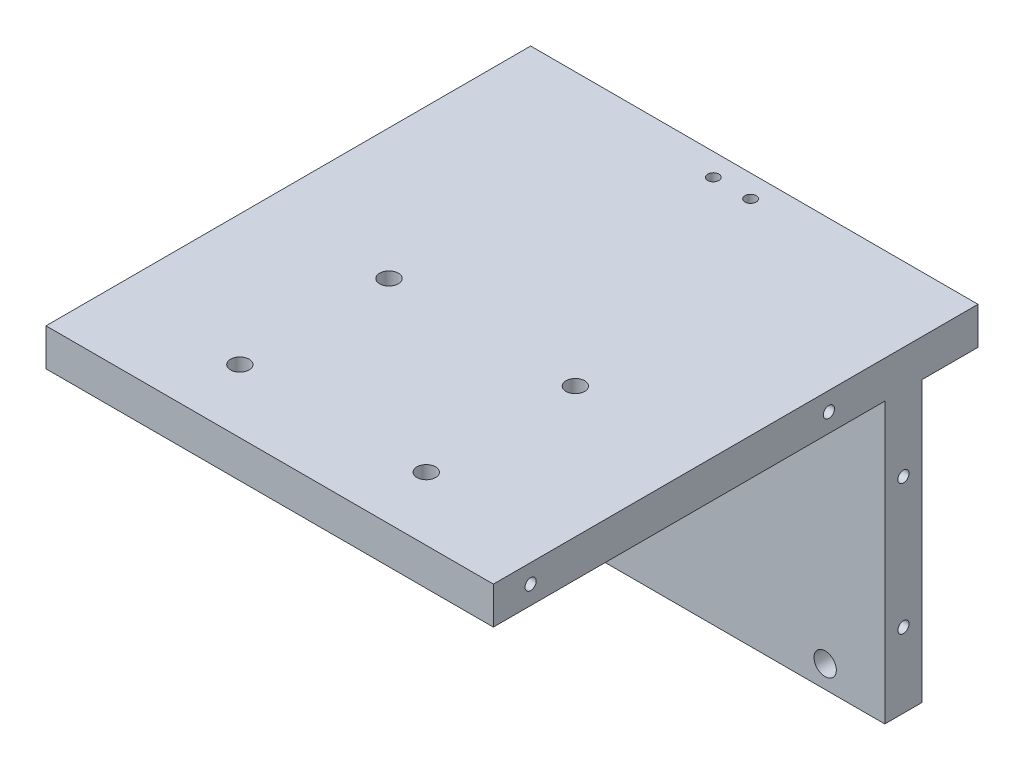
ISO-10303-21;
HEADER;
FILE_DESCRIPTION(('STEP AP214'),'2;1');
FILE_NAME('part.step','',(''),(''),'','','');
FILE_SCHEMA(('AUTOMOTIVE_DESIGN { 1 0 10303 214 1 1 1 1 }'));
ENDSEC;
DATA;
#1=APPLICATION_CONTEXT('core data for automotive mechanical design processes');
#2=APPLICATION_PROTOCOL_DEFINITION('international standard','automotive_design',2000,#1);
#3=PRODUCT_CONTEXT('',#1,'mechanical');
#4=PRODUCT('Part','Part','',(#3));
#5=PRODUCT_RELATED_PRODUCT_CATEGORY('part','',(#4));
#6=PRODUCT_DEFINITION_FORMATION('','',#4);
#7=PRODUCT_DEFINITION_CONTEXT('part definition',#1,'design');
#8=PRODUCT_DEFINITION('design','',#6,#7);
#9=PRODUCT_DEFINITION_SHAPE('','',#8);
#10=(LENGTH_UNIT() NAMED_UNIT(*) SI_UNIT(.MILLI.,.METRE.));
#11=(NAMED_UNIT(*) PLANE_ANGLE_UNIT() SI_UNIT($,.RADIAN.));
#12=(NAMED_UNIT(*) SI_UNIT($,.STERADIAN.) SOLID_ANGLE_UNIT());
#13=UNCERTAINTY_MEASURE_WITH_UNIT(LENGTH_MEASURE(1.E-05),#10,'distance_accuracy_value','');
#14=(GEOMETRIC_REPRESENTATION_CONTEXT(3) GLOBAL_UNCERTAINTY_ASSIGNED_CONTEXT((#13)) GLOBAL_UNIT_ASSIGNED_CONTEXT((#10,
#11,#12)) REPRESENTATION_CONTEXT('',''));
#15=CARTESIAN_POINT('',(0.,0.,0.));
#16=DIRECTION('',(0.,0.,1.));
#17=DIRECTION('',(1.,0.,0.));
#18=AXIS2_PLACEMENT_3D('',#15,#16,#17);
#19=CARTESIAN_POINT('',(0.,0.,10.));
#20=DIRECTION('',(0.,0.,1.));
#21=DIRECTION('',(1.,0.,0.));
#22=AXIS2_PLACEMENT_3D('',#19,#20,#21);
#23=PLANE('',#22);
#24=CARTESIAN_POINT('',(2.09489001666563E-13,-10.,10.));
#25=DIRECTION('',(0.,0.,1.));
#26=DIRECTION('',(1.,0.,0.));
#27=AXIS2_PLACEMENT_3D('',#24,#25,#26);
#28=CIRCLE('',#27,2.5);
#29=CARTESIAN_POINT('',(2.50000000000021,-10.,10.));
#30=VERTEX_POINT('',#29);
#31=EDGE_CURVE('E170',#30,#30,#28,.T.);
#32=ORIENTED_EDGE('',*,*,#31,.F.);
#33=EDGE_LOOP('',(#32));
#34=FACE_BOUND('',#33,.T.);
#35=CARTESIAN_POINT('',(0.,10.,10.));
#36=DIRECTION('',(0.,0.,1.));
#37=DIRECTION('',(1.,0.,0.));
#38=AXIS2_PLACEMENT_3D('',#35,#36,#37);
#39=CIRCLE('',#38,2.5);
#40=CARTESIAN_POINT('',(2.5,10.,10.));
#41=VERTEX_POINT('',#40);
#42=EDGE_CURVE('E164',#41,#41,#39,.T.);
#43=ORIENTED_EDGE('',*,*,#42,.F.);
#44=EDGE_LOOP('',(#43));
#45=FACE_BOUND('',#44,.T.);
#46=CARTESIAN_POINT('',(-43.9999999999993,-31.5,10.));
#47=DIRECTION('',(0.,0.,1.));
#48=DIRECTION('',(1.,0.,0.));
#49=AXIS2_PLACEMENT_3D('',#46,#47,#48);
#50=CIRCLE('',#49,3.);
#51=CARTESIAN_POINT('',(-40.9999999999993,-31.5,10.));
#52=VERTEX_POINT('',#51);
#53=EDGE_CURVE('E147',#52,#52,#50,.T.);
#54=ORIENTED_EDGE('',*,*,#53,.F.);
#55=EDGE_LOOP('',(#54));
#56=FACE_BOUND('',#55,.T.);
#57=CARTESIAN_POINT('',(-44.,31.5,10.));
#58=DIRECTION('',(0.,0.,1.));
#59=DIRECTION('',(1.,0.,0.));
#60=AXIS2_PLACEMENT_3D('',#57,#58,#59);
#61=CIRCLE('',#60,3.);
#62=CARTESIAN_POINT('',(-41.,31.5,10.));
#63=VERTEX_POINT('',#62);
#64=EDGE_CURVE('E133',#63,#63,#61,.T.);
#65=ORIENTED_EDGE('',*,*,#64,.F.);
#66=EDGE_LOOP('',(#65));
#67=FACE_BOUND('',#66,.T.);
#68=DIRECTION('',(0.,1.,0.));
#69=VECTOR('',#68,1.);
#70=CARTESIAN_POINT('',(60.,37.5,10.));
#71=LINE('',#70,#69);
#72=CARTESIAN_POINT('',(60.,-37.5,10.));
#73=VERTEX_POINT('',#72);
#74=CARTESIAN_POINT('',(60.,37.5,10.));
#75=VERTEX_POINT('',#74);
#76=EDGE_CURVE('E103',#73,#75,#71,.T.);
#77=ORIENTED_EDGE('',*,*,#76,.T.);
#78=DIRECTION('',(-1.,0.,0.));
#79=VECTOR('',#78,1.);
#80=CARTESIAN_POINT('',(-60.,37.5,10.));
#81=LINE('',#80,#79);
#82=CARTESIAN_POINT('',(-60.,37.5,10.));
#83=VERTEX_POINT('',#82);
#84=EDGE_CURVE('E89',#75,#83,#81,.T.);
#85=ORIENTED_EDGE('',*,*,#84,.T.);
#86=DIRECTION('',(0.,-1.,0.));
#87=VECTOR('',#86,1.);
#88=CARTESIAN_POINT('',(-60.,37.5,10.));
#89=LINE('',#88,#87);
#90=CARTESIAN_POINT('',(-60.,-37.5,10.));
#91=VERTEX_POINT('',#90);
#92=EDGE_CURVE('E101',#83,#91,#89,.T.);
#93=ORIENTED_EDGE('',*,*,#92,.T.);
#94=DIRECTION('',(1.,0.,0.));
#95=VECTOR('',#94,1.);
#96=CARTESIAN_POINT('',(-60.,-37.5,10.));
#97=LINE('',#96,#95);
#98=EDGE_CURVE('E54',#91,#73,#97,.T.);
#99=ORIENTED_EDGE('',*,*,#98,.T.);
#100=EDGE_LOOP('',(#77,#85,#93,#99));
#101=FACE_BOUND('',#100,.T.);
#102=CARTESIAN_POINT('',(44.,31.5,10.));
#103=DIRECTION('',(0.,0.,1.));
#104=DIRECTION('',(1.,0.,0.));
#105=AXIS2_PLACEMENT_3D('',#102,#103,#104);
#106=CIRCLE('',#105,3.);
#107=CARTESIAN_POINT('',(47.,31.5,10.));
#108=VERTEX_POINT('',#107);
#109=EDGE_CURVE('E140',#108,#108,#106,.T.);
#110=ORIENTED_EDGE('',*,*,#109,.F.);
#111=EDGE_LOOP('',(#110));
#112=FACE_BOUND('',#111,.T.);
#113=CARTESIAN_POINT('',(44.0000000000007,-31.5,10.));
#114=DIRECTION('',(0.,0.,1.));
#115=DIRECTION('',(1.,0.,0.));
#116=AXIS2_PLACEMENT_3D('',#113,#114,#115);
#117=CIRCLE('',#116,3.);
#118=CARTESIAN_POINT('',(47.0000000000007,-31.5,10.));
#119=VERTEX_POINT('',#118);
#120=EDGE_CURVE('E153',#119,#119,#117,.T.);
#121=ORIENTED_EDGE('',*,*,#120,.F.);
#122=EDGE_LOOP('',(#121));
#123=FACE_BOUND('',#122,.T.);
#124=ADVANCED_FACE('F35',(#34,#45,#56,#67,#101,#112,#123),#23,.T.);
#125=CARTESIAN_POINT('',(0.,0.,0.));
#126=DIRECTION('',(0.,0.,1.));
#127=DIRECTION('',(1.,0.,0.));
#128=AXIS2_PLACEMENT_3D('',#125,#126,#127);
#129=PLANE('',#128);
#130=CARTESIAN_POINT('',(2.09489001666563E-13,-10.,0.));
#131=DIRECTION('',(0.,0.,1.));
#132=DIRECTION('',(1.,0.,0.));
#133=AXIS2_PLACEMENT_3D('',#130,#131,#132);
#134=CIRCLE('',#133,2.5);
#135=CARTESIAN_POINT('',(2.50000000000021,-10.,0.));
#136=VERTEX_POINT('',#135);
#137=EDGE_CURVE('E167',#136,#136,#134,.F.);
#138=ORIENTED_EDGE('',*,*,#137,.F.);
#139=EDGE_LOOP('',(#138));
#140=FACE_BOUND('',#139,.T.);
#141=CARTESIAN_POINT('',(0.,10.,0.));
#142=DIRECTION('',(0.,0.,1.));
#143=DIRECTION('',(1.,0.,0.));
#144=AXIS2_PLACEMENT_3D('',#141,#142,#143);
#145=CIRCLE('',#144,2.5);
#146=CARTESIAN_POINT('',(2.5,10.,0.));
#147=VERTEX_POINT('',#146);
#148=EDGE_CURVE('E159',#147,#147,#145,.F.);
#149=ORIENTED_EDGE('',*,*,#148,.F.);
#150=EDGE_LOOP('',(#149));
#151=FACE_BOUND('',#150,.T.);
#152=CARTESIAN_POINT('',(-43.9999999999993,-31.5,0.));
#153=DIRECTION('',(0.,0.,1.));
#154=DIRECTION('',(1.,0.,0.));
#155=AXIS2_PLACEMENT_3D('',#152,#153,#154);
#156=CIRCLE('',#155,3.);
#157=CARTESIAN_POINT('',(-40.9999999999993,-31.5,0.));
#158=VERTEX_POINT('',#157);
#159=EDGE_CURVE('E150',#158,#158,#156,.T.);
#160=ORIENTED_EDGE('',*,*,#159,.T.);
#161=EDGE_LOOP('',(#160));
#162=FACE_BOUND('',#161,.T.);
#163=CARTESIAN_POINT('',(-44.,31.5,0.));
#164=DIRECTION('',(0.,0.,1.));
#165=DIRECTION('',(1.,0.,0.));
#166=AXIS2_PLACEMENT_3D('',#163,#164,#165);
#167=CIRCLE('',#166,3.);
#168=CARTESIAN_POINT('',(-41.,31.5,0.));
#169=VERTEX_POINT('',#168);
#170=EDGE_CURVE('E135',#169,#169,#167,.T.);
#171=ORIENTED_EDGE('',*,*,#170,.T.);
#172=EDGE_LOOP('',(#171));
#173=FACE_BOUND('',#172,.T.);
#174=DIRECTION('',(0.,1.,0.));
#175=VECTOR('',#174,1.);
#176=CARTESIAN_POINT('',(60.,37.5,0.));
#177=LINE('',#176,#175);
#178=CARTESIAN_POINT('',(60.,-37.5,0.));
#179=VERTEX_POINT('',#178);
#180=CARTESIAN_POINT('',(60.,37.5,0.));
#181=VERTEX_POINT('',#180);
#182=EDGE_CURVE('E119',#179,#181,#177,.T.);
#183=ORIENTED_EDGE('',*,*,#182,.F.);
#184=DIRECTION('',(1.,0.,0.));
#185=VECTOR('',#184,1.);
#186=CARTESIAN_POINT('',(-60.,-37.5,0.));
#187=LINE('',#186,#185);
#188=CARTESIAN_POINT('',(-60.,-37.5,0.));
#189=VERTEX_POINT('',#188);
#190=EDGE_CURVE('E113',#189,#179,#187,.T.);
#191=ORIENTED_EDGE('',*,*,#190,.F.);
#192=DIRECTION('',(0.,-1.,0.));
#193=VECTOR('',#192,1.);
#194=CARTESIAN_POINT('',(-60.,37.5,0.));
#195=LINE('',#194,#193);
#196=CARTESIAN_POINT('',(-60.,37.5,0.));
#197=VERTEX_POINT('',#196);
#198=EDGE_CURVE('E66',#197,#189,#195,.T.);
#199=ORIENTED_EDGE('',*,*,#198,.F.);
#200=DIRECTION('',(-1.,0.,0.));
#201=VECTOR('',#200,1.);
#202=CARTESIAN_POINT('',(-60.,37.5,0.));
#203=LINE('',#202,#201);
#204=EDGE_CURVE('E116',#181,#197,#203,.T.);
#205=ORIENTED_EDGE('',*,*,#204,.F.);
#206=EDGE_LOOP('',(#183,#191,#199,#205));
#207=FACE_BOUND('',#206,.T.);
#208=CARTESIAN_POINT('',(44.,31.5,0.));
#209=DIRECTION('',(0.,0.,1.));
#210=DIRECTION('',(1.,0.,0.));
#211=AXIS2_PLACEMENT_3D('',#208,#209,#210);
#212=CIRCLE('',#211,3.);
#213=CARTESIAN_POINT('',(47.,31.5,0.));
#214=VERTEX_POINT('',#213);
#215=EDGE_CURVE('E143',#214,#214,#212,.T.);
#216=ORIENTED_EDGE('',*,*,#215,.T.);
#217=EDGE_LOOP('',(#216));
#218=FACE_BOUND('',#217,.T.);
#219=CARTESIAN_POINT('',(44.0000000000007,-31.5,0.));
#220=DIRECTION('',(0.,0.,1.));
#221=DIRECTION('',(1.,0.,0.));
#222=AXIS2_PLACEMENT_3D('',#219,#220,#221);
#223=CIRCLE('',#222,3.);
#224=CARTESIAN_POINT('',(47.0000000000007,-31.5,0.));
#225=VERTEX_POINT('',#224);
#226=EDGE_CURVE('E156',#225,#225,#223,.T.);
#227=ORIENTED_EDGE('',*,*,#226,.T.);
#228=EDGE_LOOP('',(#227));
#229=FACE_BOUND('',#228,.T.);
#230=ADVANCED_FACE('F131',(#140,#151,#162,#173,#207,#218,#229),#129,.F.);
#231=CARTESIAN_POINT('',(60.,37.5,10.));
#232=DIRECTION('',(-1.,0.,0.));
#233=DIRECTION('',(0.,-1.,0.));
#234=AXIS2_PLACEMENT_3D('',#231,#232,#233);
#235=PLANE('',#234);
#236=CARTESIAN_POINT('',(60.,42.5,25.));
#237=DIRECTION('',(1.,0.,0.));
#238=DIRECTION('',(0.,1.,0.));
#239=AXIS2_PLACEMENT_3D('',#236,#237,#238);
#240=CIRCLE('',#239,1.5);
#241=CARTESIAN_POINT('',(60.,44.,25.));
#242=VERTEX_POINT('',#241);
#243=EDGE_CURVE('E240',#242,#242,#240,.T.);
#244=ORIENTED_EDGE('',*,*,#243,.F.);
#245=EDGE_LOOP('',(#244));
#246=FACE_BOUND('',#245,.T.);
#247=CARTESIAN_POINT('',(60.,42.5,105.));
#248=DIRECTION('',(1.,0.,0.));
#249=DIRECTION('',(0.,1.,0.));
#250=AXIS2_PLACEMENT_3D('',#247,#248,#249);
#251=CIRCLE('',#250,1.5);
#252=CARTESIAN_POINT('',(60.,44.,105.));
#253=VERTEX_POINT('',#252);
#254=EDGE_CURVE('E234',#253,#253,#251,.T.);
#255=ORIENTED_EDGE('',*,*,#254,.F.);
#256=EDGE_LOOP('',(#255));
#257=FACE_BOUND('',#256,.T.);
#258=CARTESIAN_POINT('',(60.,-17.5,4.99999999999963));
#259=DIRECTION('',(1.,0.,0.));
#260=DIRECTION('',(0.,1.,0.));
#261=AXIS2_PLACEMENT_3D('',#258,#259,#260);
#262=CIRCLE('',#261,1.5);
#263=CARTESIAN_POINT('',(60.,-16.,4.99999999999963));
#264=VERTEX_POINT('',#263);
#265=EDGE_CURVE('E180',#264,#264,#262,.T.);
#266=ORIENTED_EDGE('',*,*,#265,.F.);
#267=EDGE_LOOP('',(#266));
#268=FACE_BOUND('',#267,.T.);
#269=CARTESIAN_POINT('',(60.,17.5,5.));
#270=DIRECTION('',(1.,0.,0.));
#271=DIRECTION('',(0.,1.,0.));
#272=AXIS2_PLACEMENT_3D('',#269,#270,#271);
#273=CIRCLE('',#272,1.5);
#274=CARTESIAN_POINT('',(60.,19.,5.));
#275=VERTEX_POINT('',#274);
#276=EDGE_CURVE('E174',#275,#275,#273,.T.);
#277=ORIENTED_EDGE('',*,*,#276,.F.);
#278=EDGE_LOOP('',(#277));
#279=FACE_BOUND('',#278,.T.);
#280=ORIENTED_EDGE('',*,*,#182,.T.);
#281=DIRECTION('',(0.,0.,-1.));
#282=VECTOR('',#281,1.);
#283=CARTESIAN_POINT('',(60.,37.5,-15.));
#284=LINE('',#283,#282);
#285=CARTESIAN_POINT('',(60.,37.5,-15.));
#286=VERTEX_POINT('',#285);
#287=EDGE_CURVE('E75',#181,#286,#284,.T.);
#288=ORIENTED_EDGE('',*,*,#287,.T.);
#289=DIRECTION('',(0.,-1.,0.));
#290=VECTOR('',#289,1.);
#291=CARTESIAN_POINT('',(60.,47.5,-15.));
#292=LINE('',#291,#290);
#293=CARTESIAN_POINT('',(60.,47.5,-15.));
#294=VERTEX_POINT('',#293);
#295=EDGE_CURVE('E213',#294,#286,#292,.T.);
#296=ORIENTED_EDGE('',*,*,#295,.F.);
#297=DIRECTION('',(0.,0.,-1.));
#298=VECTOR('',#297,1.);
#299=CARTESIAN_POINT('',(60.,47.5,-15.));
#300=LINE('',#299,#298);
#301=CARTESIAN_POINT('',(60.,47.5,115.));
#302=VERTEX_POINT('',#301);
#303=EDGE_CURVE('E226',#302,#294,#300,.T.);
#304=ORIENTED_EDGE('',*,*,#303,.F.);
#305=DIRECTION('',(0.,-1.,0.));
#306=VECTOR('',#305,1.);
#307=CARTESIAN_POINT('',(60.,47.5,115.));
#308=LINE('',#307,#306);
#309=CARTESIAN_POINT('',(60.,37.5,115.));
#310=VERTEX_POINT('',#309);
#311=EDGE_CURVE('E217',#302,#310,#308,.T.);
#312=ORIENTED_EDGE('',*,*,#311,.T.);
#313=EDGE_CURVE('E200',#310,#75,#284,.T.);
#314=ORIENTED_EDGE('',*,*,#313,.T.);
#315=ORIENTED_EDGE('',*,*,#76,.F.);
#316=DIRECTION('',(0.,0.,-1.));
#317=VECTOR('',#316,1.);
#318=CARTESIAN_POINT('',(60.,-37.5,10.));
#319=LINE('',#318,#317);
#320=EDGE_CURVE('E45',#73,#179,#319,.T.);
#321=ORIENTED_EDGE('',*,*,#320,.T.);
#322=EDGE_LOOP('',(#280,#288,#296,#304,#312,#314,#315,#321));
#323=FACE_BOUND('',#322,.T.);
#324=ADVANCED_FACE('F37',(#246,#257,#268,#279,#323),#235,.F.);
#325=CARTESIAN_POINT('',(-60.,37.5,10.));
#326=DIRECTION('',(1.,0.,0.));
#327=DIRECTION('',(0.,1.,0.));
#328=AXIS2_PLACEMENT_3D('',#325,#326,#327);
#329=PLANE('',#328);
#330=CARTESIAN_POINT('',(-60.,42.5,25.));
#331=DIRECTION('',(1.,0.,0.));
#332=DIRECTION('',(0.,1.,0.));
#333=AXIS2_PLACEMENT_3D('',#330,#331,#332);
#334=CIRCLE('',#333,1.5);
#335=CARTESIAN_POINT('',(-60.,44.,25.));
#336=VERTEX_POINT('',#335);
#337=EDGE_CURVE('E249',#336,#336,#334,.T.);
#338=ORIENTED_EDGE('',*,*,#337,.T.);
#339=EDGE_LOOP('',(#338));
#340=FACE_BOUND('',#339,.T.);
#341=CARTESIAN_POINT('',(-60.,42.5,105.));
#342=DIRECTION('',(1.,0.,0.));
#343=DIRECTION('',(0.,1.,0.));
#344=AXIS2_PLACEMENT_3D('',#341,#342,#343);
#345=CIRCLE('',#344,1.5);
#346=CARTESIAN_POINT('',(-60.,44.,105.));
#347=VERTEX_POINT('',#346);
#348=EDGE_CURVE('E243',#347,#347,#345,.T.);
#349=ORIENTED_EDGE('',*,*,#348,.T.);
#350=EDGE_LOOP('',(#349));
#351=FACE_BOUND('',#350,.T.);
#352=CARTESIAN_POINT('',(-60.,-17.5,4.99999999999963));
#353=DIRECTION('',(1.,0.,0.));
#354=DIRECTION('',(0.,1.,0.));
#355=AXIS2_PLACEMENT_3D('',#352,#353,#354);
#356=CIRCLE('',#355,1.5);
#357=CARTESIAN_POINT('',(-60.,-16.,4.99999999999963));
#358=VERTEX_POINT('',#357);
#359=EDGE_CURVE('E189',#358,#358,#356,.T.);
#360=ORIENTED_EDGE('',*,*,#359,.T.);
#361=EDGE_LOOP('',(#360));
#362=FACE_BOUND('',#361,.T.);
#363=CARTESIAN_POINT('',(-60.,17.5,5.));
#364=DIRECTION('',(1.,0.,0.));
#365=DIRECTION('',(0.,1.,0.));
#366=AXIS2_PLACEMENT_3D('',#363,#364,#365);
#367=CIRCLE('',#366,1.5);
#368=CARTESIAN_POINT('',(-60.,19.,5.));
#369=VERTEX_POINT('',#368);
#370=EDGE_CURVE('E183',#369,#369,#367,.T.);
#371=ORIENTED_EDGE('',*,*,#370,.T.);
#372=EDGE_LOOP('',(#371));
#373=FACE_BOUND('',#372,.T.);
#374=ORIENTED_EDGE('',*,*,#198,.T.);
#375=DIRECTION('',(0.,0.,-1.));
#376=VECTOR('',#375,1.);
#377=CARTESIAN_POINT('',(-60.,-37.5,10.));
#378=LINE('',#377,#376);
#379=EDGE_CURVE('E11',#91,#189,#378,.T.);
#380=ORIENTED_EDGE('',*,*,#379,.F.);
#381=ORIENTED_EDGE('',*,*,#92,.F.);
#382=DIRECTION('',(0.,0.,1.));
#383=VECTOR('',#382,1.);
#384=CARTESIAN_POINT('',(-60.,37.5,-15.));
#385=LINE('',#384,#383);
#386=CARTESIAN_POINT('',(-60.,37.5,115.));
#387=VERTEX_POINT('',#386);
#388=EDGE_CURVE('E85',#83,#387,#385,.T.);
#389=ORIENTED_EDGE('',*,*,#388,.T.);
#390=DIRECTION('',(0.,-1.,0.));
#391=VECTOR('',#390,1.);
#392=CARTESIAN_POINT('',(-60.,47.5,115.));
#393=LINE('',#392,#391);
#394=CARTESIAN_POINT('',(-60.,47.5,115.));
#395=VERTEX_POINT('',#394);
#396=EDGE_CURVE('E195',#395,#387,#393,.T.);
#397=ORIENTED_EDGE('',*,*,#396,.F.);
#398=DIRECTION('',(0.,0.,1.));
#399=VECTOR('',#398,1.);
#400=CARTESIAN_POINT('',(-60.,47.5,-15.));
#401=LINE('',#400,#399);
#402=CARTESIAN_POINT('',(-60.,47.5,-15.));
#403=VERTEX_POINT('',#402);
#404=EDGE_CURVE('E209',#403,#395,#401,.T.);
#405=ORIENTED_EDGE('',*,*,#404,.F.);
#406=DIRECTION('',(0.,-1.,0.));
#407=VECTOR('',#406,1.);
#408=CARTESIAN_POINT('',(-60.,47.5,-15.));
#409=LINE('',#408,#407);
#410=CARTESIAN_POINT('',(-60.,37.5,-15.));
#411=VERTEX_POINT('',#410);
#412=EDGE_CURVE('E210',#403,#411,#409,.T.);
#413=ORIENTED_EDGE('',*,*,#412,.T.);
#414=EDGE_CURVE('E97',#411,#197,#385,.T.);
#415=ORIENTED_EDGE('',*,*,#414,.T.);
#416=EDGE_LOOP('',(#374,#380,#381,#389,#397,#405,#413,#415));
#417=FACE_BOUND('',#416,.T.);
#418=ADVANCED_FACE('F105',(#340,#351,#362,#373,#417),#329,.F.);
#419=CARTESIAN_POINT('',(-60.,-37.5,10.));
#420=DIRECTION('',(0.,1.,0.));
#421=DIRECTION('',(0.,0.,1.));
#422=AXIS2_PLACEMENT_3D('',#419,#420,#421);
#423=PLANE('',#422);
#424=ORIENTED_EDGE('',*,*,#190,.T.);
#425=ORIENTED_EDGE('',*,*,#320,.F.);
#426=ORIENTED_EDGE('',*,*,#98,.F.);
#427=ORIENTED_EDGE('',*,*,#379,.T.);
#428=EDGE_LOOP('',(#424,#425,#426,#427));
#429=FACE_BOUND('',#428,.T.);
#430=ADVANCED_FACE('F375',(#429),#423,.F.);
#431=CARTESIAN_POINT('',(-44.,31.5,10.));
#432=DIRECTION('',(0.,0.,-1.));
#433=DIRECTION('',(-1.,0.,0.));
#434=AXIS2_PLACEMENT_3D('',#431,#432,#433);
#435=CYLINDRICAL_SURFACE('',#434,3.);
#436=ORIENTED_EDGE('',*,*,#64,.T.);
#437=EDGE_LOOP('',(#436));
#438=FACE_BOUND('',#437,.T.);
#439=ORIENTED_EDGE('',*,*,#170,.F.);
#440=EDGE_LOOP('',(#439));
#441=FACE_BOUND('',#440,.T.);
#442=ADVANCED_FACE('F372',(#438,#441),#435,.F.);
#443=CARTESIAN_POINT('',(44.,31.5,10.));
#444=DIRECTION('',(0.,0.,-1.));
#445=DIRECTION('',(-1.,0.,0.));
#446=AXIS2_PLACEMENT_3D('',#443,#444,#445);
#447=CYLINDRICAL_SURFACE('',#446,3.);
#448=ORIENTED_EDGE('',*,*,#109,.T.);
#449=EDGE_LOOP('',(#448));
#450=FACE_BOUND('',#449,.T.);
#451=ORIENTED_EDGE('',*,*,#215,.F.);
#452=EDGE_LOOP('',(#451));
#453=FACE_BOUND('',#452,.T.);
#454=ADVANCED_FACE('F436',(#450,#453),#447,.F.);
#455=CARTESIAN_POINT('',(-43.9999999999993,-31.5,10.));
#456=DIRECTION('',(0.,0.,-1.));
#457=DIRECTION('',(-1.,0.,0.));
#458=AXIS2_PLACEMENT_3D('',#455,#456,#457);
#459=CYLINDRICAL_SURFACE('',#458,3.);
#460=ORIENTED_EDGE('',*,*,#53,.T.);
#461=EDGE_LOOP('',(#460));
#462=FACE_BOUND('',#461,.T.);
#463=ORIENTED_EDGE('',*,*,#159,.F.);
#464=EDGE_LOOP('',(#463));
#465=FACE_BOUND('',#464,.T.);
#466=ADVANCED_FACE('F433',(#462,#465),#459,.F.);
#467=CARTESIAN_POINT('',(44.0000000000007,-31.5,10.));
#468=DIRECTION('',(0.,0.,-1.));
#469=DIRECTION('',(-1.,0.,0.));
#470=AXIS2_PLACEMENT_3D('',#467,#468,#469);
#471=CYLINDRICAL_SURFACE('',#470,3.);
#472=ORIENTED_EDGE('',*,*,#120,.T.);
#473=EDGE_LOOP('',(#472));
#474=FACE_BOUND('',#473,.T.);
#475=ORIENTED_EDGE('',*,*,#226,.F.);
#476=EDGE_LOOP('',(#475));
#477=FACE_BOUND('',#476,.T.);
#478=ADVANCED_FACE('F429',(#474,#477),#471,.F.);
#479=CARTESIAN_POINT('',(0.,10.,-7.07106781186548));
#480=DIRECTION('',(0.,0.,1.));
#481=DIRECTION('',(1.,0.,0.));
#482=AXIS2_PLACEMENT_3D('',#479,#480,#481);
#483=CYLINDRICAL_SURFACE('',#482,2.5);
#484=ORIENTED_EDGE('',*,*,#148,.T.);
#485=EDGE_LOOP('',(#484));
#486=FACE_BOUND('',#485,.T.);
#487=ORIENTED_EDGE('',*,*,#42,.T.);
#488=EDGE_LOOP('',(#487));
#489=FACE_BOUND('',#488,.T.);
#490=ADVANCED_FACE('F425',(#486,#489),#483,.F.);
#491=CARTESIAN_POINT('',(2.09489001666563E-13,-10.,-7.07106781186548));
#492=DIRECTION('',(0.,0.,1.));
#493=DIRECTION('',(1.,0.,0.));
#494=AXIS2_PLACEMENT_3D('',#491,#492,#493);
#495=CYLINDRICAL_SURFACE('',#494,2.5);
#496=ORIENTED_EDGE('',*,*,#137,.T.);
#497=EDGE_LOOP('',(#496));
#498=FACE_BOUND('',#497,.T.);
#499=ORIENTED_EDGE('',*,*,#31,.T.);
#500=EDGE_LOOP('',(#499));
#501=FACE_BOUND('',#500,.T.);
#502=ADVANCED_FACE('F421',(#498,#501),#495,.F.);
#503=CARTESIAN_POINT('',(50.,17.5,5.));
#504=DIRECTION('',(1.,0.,0.));
#505=DIRECTION('',(0.,1.,0.));
#506=AXIS2_PLACEMENT_3D('',#503,#504,#505);
#507=CYLINDRICAL_SURFACE('',#506,1.5);
#508=CARTESIAN_POINT('',(50.,17.5,5.));
#509=DIRECTION('',(1.,0.,0.));
#510=DIRECTION('',(0.,1.,0.));
#511=AXIS2_PLACEMENT_3D('',#508,#509,#510);
#512=CIRCLE('',#511,1.5);
#513=CARTESIAN_POINT('',(50.,19.,5.));
#514=VERTEX_POINT('',#513);
#515=EDGE_CURVE('E173',#514,#514,#512,.T.);
#516=ORIENTED_EDGE('',*,*,#515,.F.);
#517=EDGE_LOOP('',(#516));
#518=FACE_BOUND('',#517,.T.);
#519=ORIENTED_EDGE('',*,*,#276,.T.);
#520=EDGE_LOOP('',(#519));
#521=FACE_BOUND('',#520,.T.);
#522=ADVANCED_FACE('F417',(#518,#521),#507,.F.);
#523=CARTESIAN_POINT('',(50.,17.5,5.));
#524=DIRECTION('',(1.,0.,0.));
#525=DIRECTION('',(0.,1.,0.));
#526=AXIS2_PLACEMENT_3D('',#523,#524,#525);
#527=PLANE('',#526);
#528=ORIENTED_EDGE('',*,*,#515,.T.);
#529=EDGE_LOOP('',(#528));
#530=FACE_BOUND('',#529,.T.);
#531=ADVANCED_FACE('F413',(#530),#527,.T.);
#532=CARTESIAN_POINT('',(50.,-17.5,4.99999999999963));
#533=DIRECTION('',(1.,0.,0.));
#534=DIRECTION('',(0.,1.,0.));
#535=AXIS2_PLACEMENT_3D('',#532,#533,#534);
#536=CYLINDRICAL_SURFACE('',#535,1.5);
#537=CARTESIAN_POINT('',(50.,-17.5,4.99999999999963));
#538=DIRECTION('',(1.,0.,0.));
#539=DIRECTION('',(0.,1.,0.));
#540=AXIS2_PLACEMENT_3D('',#537,#538,#539);
#541=CIRCLE('',#540,1.5);
#542=CARTESIAN_POINT('',(50.,-16.,4.99999999999963));
#543=VERTEX_POINT('',#542);
#544=EDGE_CURVE('E177',#543,#543,#541,.T.);
#545=ORIENTED_EDGE('',*,*,#544,.F.);
#546=EDGE_LOOP('',(#545));
#547=FACE_BOUND('',#546,.T.);
#548=ORIENTED_EDGE('',*,*,#265,.T.);
#549=EDGE_LOOP('',(#548));
#550=FACE_BOUND('',#549,.T.);
#551=ADVANCED_FACE('F409',(#547,#550),#536,.F.);
#552=CARTESIAN_POINT('',(50.,-17.5,4.99999999999963));
#553=DIRECTION('',(1.,0.,0.));
#554=DIRECTION('',(0.,1.,0.));
#555=AXIS2_PLACEMENT_3D('',#552,#553,#554);
#556=PLANE('',#555);
#557=ORIENTED_EDGE('',*,*,#544,.T.);
#558=EDGE_LOOP('',(#557));
#559=FACE_BOUND('',#558,.T.);
#560=ADVANCED_FACE('F395',(#559),#556,.T.);
#561=CARTESIAN_POINT('',(-60.,17.5,5.));
#562=DIRECTION('',(1.,0.,0.));
#563=DIRECTION('',(0.,1.,0.));
#564=AXIS2_PLACEMENT_3D('',#561,#562,#563);
#565=CYLINDRICAL_SURFACE('',#564,1.5);
#566=ORIENTED_EDGE('',*,*,#370,.F.);
#567=EDGE_LOOP('',(#566));
#568=FACE_BOUND('',#567,.T.);
#569=CARTESIAN_POINT('',(-50.,17.5,5.));
#570=DIRECTION('',(1.,0.,0.));
#571=DIRECTION('',(0.,1.,0.));
#572=AXIS2_PLACEMENT_3D('',#569,#570,#571);
#573=CIRCLE('',#572,1.5);
#574=CARTESIAN_POINT('',(-50.,19.,5.));
#575=VERTEX_POINT('',#574);
#576=EDGE_CURVE('E186',#575,#575,#573,.T.);
#577=ORIENTED_EDGE('',*,*,#576,.T.);
#578=EDGE_LOOP('',(#577));
#579=FACE_BOUND('',#578,.T.);
#580=ADVANCED_FACE('F391',(#568,#579),#565,.F.);
#581=CARTESIAN_POINT('',(-50.,17.5,5.));
#582=DIRECTION('',(1.,0.,0.));
#583=DIRECTION('',(0.,1.,0.));
#584=AXIS2_PLACEMENT_3D('',#581,#582,#583);
#585=PLANE('',#584);
#586=ORIENTED_EDGE('',*,*,#576,.F.);
#587=EDGE_LOOP('',(#586));
#588=FACE_BOUND('',#587,.T.);
#589=ADVANCED_FACE('F394',(#588),#585,.F.);
#590=CARTESIAN_POINT('',(-60.,-17.5,4.99999999999963));
#591=DIRECTION('',(1.,0.,0.));
#592=DIRECTION('',(0.,1.,0.));
#593=AXIS2_PLACEMENT_3D('',#590,#591,#592);
#594=CYLINDRICAL_SURFACE('',#593,1.5);
#595=ORIENTED_EDGE('',*,*,#359,.F.);
#596=EDGE_LOOP('',(#595));
#597=FACE_BOUND('',#596,.T.);
#598=CARTESIAN_POINT('',(-50.,-17.5,4.99999999999963));
#599=DIRECTION('',(1.,0.,0.));
#600=DIRECTION('',(0.,1.,0.));
#601=AXIS2_PLACEMENT_3D('',#598,#599,#600);
#602=CIRCLE('',#601,1.5);
#603=CARTESIAN_POINT('',(-50.,-16.,4.99999999999963));
#604=VERTEX_POINT('',#603);
#605=EDGE_CURVE('E192',#604,#604,#602,.T.);
#606=ORIENTED_EDGE('',*,*,#605,.T.);
#607=EDGE_LOOP('',(#606));
#608=FACE_BOUND('',#607,.T.);
#609=ADVANCED_FACE('F354',(#597,#608),#594,.F.);
#610=CARTESIAN_POINT('',(-50.,-17.5,4.99999999999963));
#611=DIRECTION('',(1.,0.,0.));
#612=DIRECTION('',(0.,1.,0.));
#613=AXIS2_PLACEMENT_3D('',#610,#611,#612);
#614=PLANE('',#613);
#615=ORIENTED_EDGE('',*,*,#605,.F.);
#616=EDGE_LOOP('',(#615));
#617=FACE_BOUND('',#616,.T.);
#618=ADVANCED_FACE('F346',(#617),#614,.F.);
#619=CARTESIAN_POINT('',(0.,37.5,0.));
#620=DIRECTION('',(0.,1.,0.));
#621=DIRECTION('',(0.,0.,1.));
#622=AXIS2_PLACEMENT_3D('',#619,#620,#621);
#623=PLANE('',#622);
#624=CARTESIAN_POINT('',(5.00000000000001,37.5,-9.));
#625=DIRECTION('',(0.,1.,0.));
#626=DIRECTION('',(0.,0.,1.));
#627=AXIS2_PLACEMENT_3D('',#624,#625,#626);
#628=CIRCLE('',#627,1.5);
#629=CARTESIAN_POINT('',(5.00000000000001,37.5,-7.5));
#630=VERTEX_POINT('',#629);
#631=EDGE_CURVE('E285',#630,#630,#628,.T.);
#632=ORIENTED_EDGE('',*,*,#631,.T.);
#633=EDGE_LOOP('',(#632));
#634=FACE_BOUND('',#633,.T.);
#635=CARTESIAN_POINT('',(-4.99999999999999,37.5,-9.));
#636=DIRECTION('',(0.,1.,0.));
#637=DIRECTION('',(0.,0.,1.));
#638=AXIS2_PLACEMENT_3D('',#635,#636,#637);
#639=CIRCLE('',#638,1.5);
#640=CARTESIAN_POINT('',(-4.99999999999999,37.5,-7.5));
#641=VERTEX_POINT('',#640);
#642=EDGE_CURVE('E279',#641,#641,#639,.T.);
#643=ORIENTED_EDGE('',*,*,#642,.T.);
#644=EDGE_LOOP('',(#643));
#645=FACE_BOUND('',#644,.T.);
#646=ORIENTED_EDGE('',*,*,#287,.F.);
#647=ORIENTED_EDGE('',*,*,#204,.T.);
#648=ORIENTED_EDGE('',*,*,#414,.F.);
#649=DIRECTION('',(-1.,0.,0.));
#650=VECTOR('',#649,1.);
#651=CARTESIAN_POINT('',(-60.,37.5,-15.));
#652=LINE('',#651,#650);
#653=EDGE_CURVE('E205',#286,#411,#652,.T.);
#654=ORIENTED_EDGE('',*,*,#653,.F.);
#655=EDGE_LOOP('',(#646,#647,#648,#654));
#656=FACE_BOUND('',#655,.T.);
#657=ADVANCED_FACE('F294',(#634,#645,#656),#623,.F.);
#658=CARTESIAN_POINT('',(-60.,47.5,115.));
#659=DIRECTION('',(0.,0.,-1.));
#660=DIRECTION('',(-1.,0.,0.));
#661=AXIS2_PLACEMENT_3D('',#658,#659,#660);
#662=PLANE('',#661);
#663=DIRECTION('',(1.,0.,0.));
#664=VECTOR('',#663,1.);
#665=CARTESIAN_POINT('',(-60.,37.5,115.));
#666=LINE('',#665,#664);
#667=EDGE_CURVE('E93',#387,#310,#666,.T.);
#668=ORIENTED_EDGE('',*,*,#667,.T.);
#669=ORIENTED_EDGE('',*,*,#311,.F.);
#670=DIRECTION('',(1.,0.,0.));
#671=VECTOR('',#670,1.);
#672=CARTESIAN_POINT('',(-60.,47.5,115.));
#673=LINE('',#672,#671);
#674=EDGE_CURVE('E229',#395,#302,#673,.T.);
#675=ORIENTED_EDGE('',*,*,#674,.F.);
#676=ORIENTED_EDGE('',*,*,#396,.T.);
#677=EDGE_LOOP('',(#668,#669,#675,#676));
#678=FACE_BOUND('',#677,.T.);
#679=ADVANCED_FACE('F330',(#678),#662,.F.);
#680=CARTESIAN_POINT('',(-60.,47.5,-15.));
#681=DIRECTION('',(0.,0.,1.));
#682=DIRECTION('',(1.,0.,0.));
#683=AXIS2_PLACEMENT_3D('',#680,#681,#682);
#684=PLANE('',#683);
#685=ORIENTED_EDGE('',*,*,#653,.T.);
#686=ORIENTED_EDGE('',*,*,#412,.F.);
#687=DIRECTION('',(-1.,0.,0.));
#688=VECTOR('',#687,1.);
#689=CARTESIAN_POINT('',(-60.,47.5,-15.));
#690=LINE('',#689,#688);
#691=EDGE_CURVE('E214',#294,#403,#690,.T.);
#692=ORIENTED_EDGE('',*,*,#691,.F.);
#693=ORIENTED_EDGE('',*,*,#295,.T.);
#694=EDGE_LOOP('',(#685,#686,#692,#693));
#695=FACE_BOUND('',#694,.T.);
#696=ADVANCED_FACE('F307',(#695),#684,.F.);
#697=CARTESIAN_POINT('',(0.,47.5,0.));
#698=DIRECTION('',(0.,1.,0.));
#699=DIRECTION('',(0.,0.,1.));
#700=AXIS2_PLACEMENT_3D('',#697,#698,#699);
#701=PLANE('',#700);
#702=CARTESIAN_POINT('',(5.00000000000001,47.5,-9.));
#703=DIRECTION('',(0.,1.,0.));
#704=DIRECTION('',(0.,0.,1.));
#705=AXIS2_PLACEMENT_3D('',#702,#703,#704);
#706=CIRCLE('',#705,1.5);
#707=CARTESIAN_POINT('',(5.00000000000001,47.5,-7.5));
#708=VERTEX_POINT('',#707);
#709=EDGE_CURVE('E288',#708,#708,#706,.T.);
#710=ORIENTED_EDGE('',*,*,#709,.F.);
#711=EDGE_LOOP('',(#710));
#712=FACE_BOUND('',#711,.T.);
#713=CARTESIAN_POINT('',(-4.99999999999999,47.5,-9.));
#714=DIRECTION('',(0.,1.,0.));
#715=DIRECTION('',(0.,0.,1.));
#716=AXIS2_PLACEMENT_3D('',#713,#714,#715);
#717=CIRCLE('',#716,1.5);
#718=CARTESIAN_POINT('',(-4.99999999999999,47.5,-7.5));
#719=VERTEX_POINT('',#718);
#720=EDGE_CURVE('E282',#719,#719,#717,.T.);
#721=ORIENTED_EDGE('',*,*,#720,.F.);
#722=EDGE_LOOP('',(#721));
#723=FACE_BOUND('',#722,.T.);
#724=CARTESIAN_POINT('',(25.,47.5,58.));
#725=DIRECTION('',(0.,1.,0.));
#726=DIRECTION('',(0.,0.,1.));
#727=AXIS2_PLACEMENT_3D('',#724,#725,#726);
#728=CIRCLE('',#727,2.5);
#729=CARTESIAN_POINT('',(25.,47.5,60.5));
#730=VERTEX_POINT('',#729);
#731=EDGE_CURVE('E276',#730,#730,#728,.T.);
#732=ORIENTED_EDGE('',*,*,#731,.F.);
#733=EDGE_LOOP('',(#732));
#734=FACE_BOUND('',#733,.T.);
#735=CARTESIAN_POINT('',(-25.,47.5,58.));
#736=DIRECTION('',(0.,1.,0.));
#737=DIRECTION('',(0.,0.,1.));
#738=AXIS2_PLACEMENT_3D('',#735,#736,#737);
#739=CIRCLE('',#738,2.5);
#740=CARTESIAN_POINT('',(-25.,47.5,60.5));
#741=VERTEX_POINT('',#740);
#742=EDGE_CURVE('E270',#741,#741,#739,.T.);
#743=ORIENTED_EDGE('',*,*,#742,.F.);
#744=EDGE_LOOP('',(#743));
#745=FACE_BOUND('',#744,.T.);
#746=CARTESIAN_POINT('',(25.,47.5,98.));
#747=DIRECTION('',(0.,1.,0.));
#748=DIRECTION('',(0.,0.,1.));
#749=AXIS2_PLACEMENT_3D('',#746,#747,#748);
#750=CIRCLE('',#749,2.5);
#751=CARTESIAN_POINT('',(25.,47.5,100.5));
#752=VERTEX_POINT('',#751);
#753=EDGE_CURVE('E264',#752,#752,#750,.T.);
#754=ORIENTED_EDGE('',*,*,#753,.F.);
#755=EDGE_LOOP('',(#754));
#756=FACE_BOUND('',#755,.T.);
#757=CARTESIAN_POINT('',(-25.,47.5,98.));
#758=DIRECTION('',(0.,1.,0.));
#759=DIRECTION('',(0.,0.,1.));
#760=AXIS2_PLACEMENT_3D('',#757,#758,#759);
#761=CIRCLE('',#760,2.5);
#762=CARTESIAN_POINT('',(-25.,47.5,100.5));
#763=VERTEX_POINT('',#762);
#764=EDGE_CURVE('E258',#763,#763,#761,.T.);
#765=ORIENTED_EDGE('',*,*,#764,.F.);
#766=EDGE_LOOP('',(#765));
#767=FACE_BOUND('',#766,.T.);
#768=ORIENTED_EDGE('',*,*,#404,.T.);
#769=ORIENTED_EDGE('',*,*,#674,.T.);
#770=ORIENTED_EDGE('',*,*,#303,.T.);
#771=ORIENTED_EDGE('',*,*,#691,.T.);
#772=EDGE_LOOP('',(#768,#769,#770,#771));
#773=FACE_BOUND('',#772,.T.);
#774=ADVANCED_FACE('F304',(#712,#723,#734,#745,#756,#767,#773),#701,.T.);
#775=CARTESIAN_POINT('',(25.,37.5,58.));
#776=DIRECTION('',(0.,1.,0.));
#777=DIRECTION('',(0.,0.,1.));
#778=AXIS2_PLACEMENT_3D('',#775,#776,#777);
#779=CIRCLE('',#778,2.5);
#780=CARTESIAN_POINT('',(25.,37.5,60.5));
#781=VERTEX_POINT('',#780);
#782=EDGE_CURVE('E273',#781,#781,#779,.T.);
#783=ORIENTED_EDGE('',*,*,#782,.T.);
#784=EDGE_LOOP('',(#783));
#785=FACE_BOUND('',#784,.T.);
#786=CARTESIAN_POINT('',(-25.,37.5,58.));
#787=DIRECTION('',(0.,1.,0.));
#788=DIRECTION('',(0.,0.,1.));
#789=AXIS2_PLACEMENT_3D('',#786,#787,#788);
#790=CIRCLE('',#789,2.5);
#791=CARTESIAN_POINT('',(-25.,37.5,60.5));
#792=VERTEX_POINT('',#791);
#793=EDGE_CURVE('E267',#792,#792,#790,.T.);
#794=ORIENTED_EDGE('',*,*,#793,.T.);
#795=EDGE_LOOP('',(#794));
#796=FACE_BOUND('',#795,.T.);
#797=CARTESIAN_POINT('',(25.,37.5,98.));
#798=DIRECTION('',(0.,1.,0.));
#799=DIRECTION('',(0.,0.,1.));
#800=AXIS2_PLACEMENT_3D('',#797,#798,#799);
#801=CIRCLE('',#800,2.5);
#802=CARTESIAN_POINT('',(25.,37.5,100.5));
#803=VERTEX_POINT('',#802);
#804=EDGE_CURVE('E261',#803,#803,#801,.T.);
#805=ORIENTED_EDGE('',*,*,#804,.T.);
#806=EDGE_LOOP('',(#805));
#807=FACE_BOUND('',#806,.T.);
#808=CARTESIAN_POINT('',(-25.,37.5,98.));
#809=DIRECTION('',(0.,1.,0.));
#810=DIRECTION('',(0.,0.,1.));
#811=AXIS2_PLACEMENT_3D('',#808,#809,#810);
#812=CIRCLE('',#811,2.5);
#813=CARTESIAN_POINT('',(-25.,37.5,100.5));
#814=VERTEX_POINT('',#813);
#815=EDGE_CURVE('E255',#814,#814,#812,.T.);
#816=ORIENTED_EDGE('',*,*,#815,.T.);
#817=EDGE_LOOP('',(#816));
#818=FACE_BOUND('',#817,.T.);
#819=ORIENTED_EDGE('',*,*,#84,.F.);
#820=ORIENTED_EDGE('',*,*,#313,.F.);
#821=ORIENTED_EDGE('',*,*,#667,.F.);
#822=ORIENTED_EDGE('',*,*,#388,.F.);
#823=EDGE_LOOP('',(#819,#820,#821,#822));
#824=FACE_BOUND('',#823,.T.);
#825=ADVANCED_FACE('F87',(#785,#796,#807,#818,#824),#623,.F.);
#826=CARTESIAN_POINT('',(50.,42.5,105.));
#827=DIRECTION('',(1.,0.,0.));
#828=DIRECTION('',(0.,1.,0.));
#829=AXIS2_PLACEMENT_3D('',#826,#827,#828);
#830=CYLINDRICAL_SURFACE('',#829,1.5);
#831=CARTESIAN_POINT('',(50.,42.5,105.));
#832=DIRECTION('',(1.,0.,0.));
#833=DIRECTION('',(0.,1.,0.));
#834=AXIS2_PLACEMENT_3D('',#831,#832,#833);
#835=CIRCLE('',#834,1.5);
#836=CARTESIAN_POINT('',(50.,44.,105.));
#837=VERTEX_POINT('',#836);
#838=EDGE_CURVE('E98',#837,#837,#835,.T.);
#839=ORIENTED_EDGE('',*,*,#838,.F.);
#840=EDGE_LOOP('',(#839));
#841=FACE_BOUND('',#840,.T.);
#842=ORIENTED_EDGE('',*,*,#254,.T.);
#843=EDGE_LOOP('',(#842));
#844=FACE_BOUND('',#843,.T.);
#845=ADVANCED_FACE('F359',(#841,#844),#830,.F.);
#846=CARTESIAN_POINT('',(50.,42.5,105.));
#847=DIRECTION('',(1.,0.,0.));
#848=DIRECTION('',(0.,1.,0.));
#849=AXIS2_PLACEMENT_3D('',#846,#847,#848);
#850=PLANE('',#849);
#851=ORIENTED_EDGE('',*,*,#838,.T.);
#852=EDGE_LOOP('',(#851));
#853=FACE_BOUND('',#852,.T.);
#854=ADVANCED_FACE('F579',(#853),#850,.T.);
#855=CARTESIAN_POINT('',(50.,42.5,25.));
#856=DIRECTION('',(1.,0.,0.));
#857=DIRECTION('',(0.,1.,0.));
#858=AXIS2_PLACEMENT_3D('',#855,#856,#857);
#859=CYLINDRICAL_SURFACE('',#858,1.5);
#860=CARTESIAN_POINT('',(50.,42.5,25.));
#861=DIRECTION('',(1.,0.,0.));
#862=DIRECTION('',(0.,1.,0.));
#863=AXIS2_PLACEMENT_3D('',#860,#861,#862);
#864=CIRCLE('',#863,1.5);
#865=CARTESIAN_POINT('',(50.,44.,25.));
#866=VERTEX_POINT('',#865);
#867=EDGE_CURVE('E237',#866,#866,#864,.T.);
#868=ORIENTED_EDGE('',*,*,#867,.F.);
#869=EDGE_LOOP('',(#868));
#870=FACE_BOUND('',#869,.T.);
#871=ORIENTED_EDGE('',*,*,#243,.T.);
#872=EDGE_LOOP('',(#871));
#873=FACE_BOUND('',#872,.T.);
#874=ADVANCED_FACE('F588',(#870,#873),#859,.F.);
#875=CARTESIAN_POINT('',(50.,42.5,25.));
#876=DIRECTION('',(1.,0.,0.));
#877=DIRECTION('',(0.,1.,0.));
#878=AXIS2_PLACEMENT_3D('',#875,#876,#877);
#879=PLANE('',#878);
#880=ORIENTED_EDGE('',*,*,#867,.T.);
#881=EDGE_LOOP('',(#880));
#882=FACE_BOUND('',#881,.T.);
#883=ADVANCED_FACE('F597',(#882),#879,.T.);
#884=CARTESIAN_POINT('',(-60.,42.5,105.));
#885=DIRECTION('',(1.,0.,0.));
#886=DIRECTION('',(0.,1.,0.));
#887=AXIS2_PLACEMENT_3D('',#884,#885,#886);
#888=CYLINDRICAL_SURFACE('',#887,1.5);
#889=ORIENTED_EDGE('',*,*,#348,.F.);
#890=EDGE_LOOP('',(#889));
#891=FACE_BOUND('',#890,.T.);
#892=CARTESIAN_POINT('',(-50.,42.5,105.));
#893=DIRECTION('',(1.,0.,0.));
#894=DIRECTION('',(0.,1.,0.));
#895=AXIS2_PLACEMENT_3D('',#892,#893,#894);
#896=CIRCLE('',#895,1.5);
#897=CARTESIAN_POINT('',(-50.,44.,105.));
#898=VERTEX_POINT('',#897);
#899=EDGE_CURVE('E246',#898,#898,#896,.T.);
#900=ORIENTED_EDGE('',*,*,#899,.T.);
#901=EDGE_LOOP('',(#900));
#902=FACE_BOUND('',#901,.T.);
#903=ADVANCED_FACE('F605',(#891,#902),#888,.F.);
#904=CARTESIAN_POINT('',(-50.,42.5,105.));
#905=DIRECTION('',(1.,0.,0.));
#906=DIRECTION('',(0.,1.,0.));
#907=AXIS2_PLACEMENT_3D('',#904,#905,#906);
#908=PLANE('',#907);
#909=ORIENTED_EDGE('',*,*,#899,.F.);
#910=EDGE_LOOP('',(#909));
#911=FACE_BOUND('',#910,.T.);
#912=ADVANCED_FACE('F613',(#911),#908,.F.);
#913=CARTESIAN_POINT('',(-60.,42.5,25.));
#914=DIRECTION('',(1.,0.,0.));
#915=DIRECTION('',(0.,1.,0.));
#916=AXIS2_PLACEMENT_3D('',#913,#914,#915);
#917=CYLINDRICAL_SURFACE('',#916,1.5);
#918=ORIENTED_EDGE('',*,*,#337,.F.);
#919=EDGE_LOOP('',(#918));
#920=FACE_BOUND('',#919,.T.);
#921=CARTESIAN_POINT('',(-50.,42.5,25.));
#922=DIRECTION('',(1.,0.,0.));
#923=DIRECTION('',(0.,1.,0.));
#924=AXIS2_PLACEMENT_3D('',#921,#922,#923);
#925=CIRCLE('',#924,1.5);
#926=CARTESIAN_POINT('',(-50.,44.,25.));
#927=VERTEX_POINT('',#926);
#928=EDGE_CURVE('E252',#927,#927,#925,.T.);
#929=ORIENTED_EDGE('',*,*,#928,.T.);
#930=EDGE_LOOP('',(#929));
#931=FACE_BOUND('',#930,.T.);
#932=ADVANCED_FACE('F622',(#920,#931),#917,.F.);
#933=CARTESIAN_POINT('',(-50.,42.5,25.));
#934=DIRECTION('',(1.,0.,0.));
#935=DIRECTION('',(0.,1.,0.));
#936=AXIS2_PLACEMENT_3D('',#933,#934,#935);
#937=PLANE('',#936);
#938=ORIENTED_EDGE('',*,*,#928,.F.);
#939=EDGE_LOOP('',(#938));
#940=FACE_BOUND('',#939,.T.);
#941=ADVANCED_FACE('F631',(#940),#937,.F.);
#942=CARTESIAN_POINT('',(-25.,37.5,98.));
#943=DIRECTION('',(0.,1.,0.));
#944=DIRECTION('',(0.,0.,1.));
#945=AXIS2_PLACEMENT_3D('',#942,#943,#944);
#946=CYLINDRICAL_SURFACE('',#945,2.5);
#947=ORIENTED_EDGE('',*,*,#815,.F.);
#948=EDGE_LOOP('',(#947));
#949=FACE_BOUND('',#948,.T.);
#950=ORIENTED_EDGE('',*,*,#764,.T.);
#951=EDGE_LOOP('',(#950));
#952=FACE_BOUND('',#951,.T.);
#953=ADVANCED_FACE('F640',(#949,#952),#946,.F.);
#954=CARTESIAN_POINT('',(25.,37.5,98.));
#955=DIRECTION('',(0.,1.,0.));
#956=DIRECTION('',(0.,0.,1.));
#957=AXIS2_PLACEMENT_3D('',#954,#955,#956);
#958=CYLINDRICAL_SURFACE('',#957,2.5);
#959=ORIENTED_EDGE('',*,*,#804,.F.);
#960=EDGE_LOOP('',(#959));
#961=FACE_BOUND('',#960,.T.);
#962=ORIENTED_EDGE('',*,*,#753,.T.);
#963=EDGE_LOOP('',(#962));
#964=FACE_BOUND('',#963,.T.);
#965=ADVANCED_FACE('F649',(#961,#964),#958,.F.);
#966=CARTESIAN_POINT('',(-25.,37.5,58.));
#967=DIRECTION('',(0.,1.,0.));
#968=DIRECTION('',(0.,0.,1.));
#969=AXIS2_PLACEMENT_3D('',#966,#967,#968);
#970=CYLINDRICAL_SURFACE('',#969,2.5);
#971=ORIENTED_EDGE('',*,*,#793,.F.);
#972=EDGE_LOOP('',(#971));
#973=FACE_BOUND('',#972,.T.);
#974=ORIENTED_EDGE('',*,*,#742,.T.);
#975=EDGE_LOOP('',(#974));
#976=FACE_BOUND('',#975,.T.);
#977=ADVANCED_FACE('F658',(#973,#976),#970,.F.);
#978=CARTESIAN_POINT('',(25.,37.5,58.));
#979=DIRECTION('',(0.,1.,0.));
#980=DIRECTION('',(0.,0.,1.));
#981=AXIS2_PLACEMENT_3D('',#978,#979,#980);
#982=CYLINDRICAL_SURFACE('',#981,2.5);
#983=ORIENTED_EDGE('',*,*,#782,.F.);
#984=EDGE_LOOP('',(#983));
#985=FACE_BOUND('',#984,.T.);
#986=ORIENTED_EDGE('',*,*,#731,.T.);
#987=EDGE_LOOP('',(#986));
#988=FACE_BOUND('',#987,.T.);
#989=ADVANCED_FACE('F667',(#985,#988),#982,.F.);
#990=CARTESIAN_POINT('',(-4.99999999999999,37.5,-9.));
#991=DIRECTION('',(0.,1.,0.));
#992=DIRECTION('',(0.,0.,1.));
#993=AXIS2_PLACEMENT_3D('',#990,#991,#992);
#994=CYLINDRICAL_SURFACE('',#993,1.5);
#995=ORIENTED_EDGE('',*,*,#642,.F.);
#996=EDGE_LOOP('',(#995));
#997=FACE_BOUND('',#996,.T.);
#998=ORIENTED_EDGE('',*,*,#720,.T.);
#999=EDGE_LOOP('',(#998));
#1000=FACE_BOUND('',#999,.T.);
#1001=ADVANCED_FACE('F300',(#997,#1000),#994,.F.);
#1002=CARTESIAN_POINT('',(5.00000000000001,37.5,-9.));
#1003=DIRECTION('',(0.,1.,0.));
#1004=DIRECTION('',(0.,0.,1.));
#1005=AXIS2_PLACEMENT_3D('',#1002,#1003,#1004);
#1006=CYLINDRICAL_SURFACE('',#1005,1.5);
#1007=ORIENTED_EDGE('',*,*,#631,.F.);
#1008=EDGE_LOOP('',(#1007));
#1009=FACE_BOUND('',#1008,.T.);
#1010=ORIENTED_EDGE('',*,*,#709,.T.);
#1011=EDGE_LOOP('',(#1010));
#1012=FACE_BOUND('',#1011,.T.);
#1013=ADVANCED_FACE('F297',(#1009,#1012),#1006,.F.);
#1014=CLOSED_SHELL('',(#124,#230,#324,#418,#430,#442,#454,#466,#478,#490,#502,#522,#531,#551,
#560,#580,#589,#609,#618,#657,#679,#696,#774,#825,#845,#854,#874,#883,#903,#912,#932,#941,#953,
#965,#977,#989,#1001,#1013));
#1015=MANIFOLD_SOLID_BREP('B2',#1014);
#1016=ADVANCED_BREP_SHAPE_REPRESENTATION('',(#18,#1015),#14);
#1017=SHAPE_DEFINITION_REPRESENTATION(#9,#1016);
ENDSEC;
END-ISO-10303-21;
